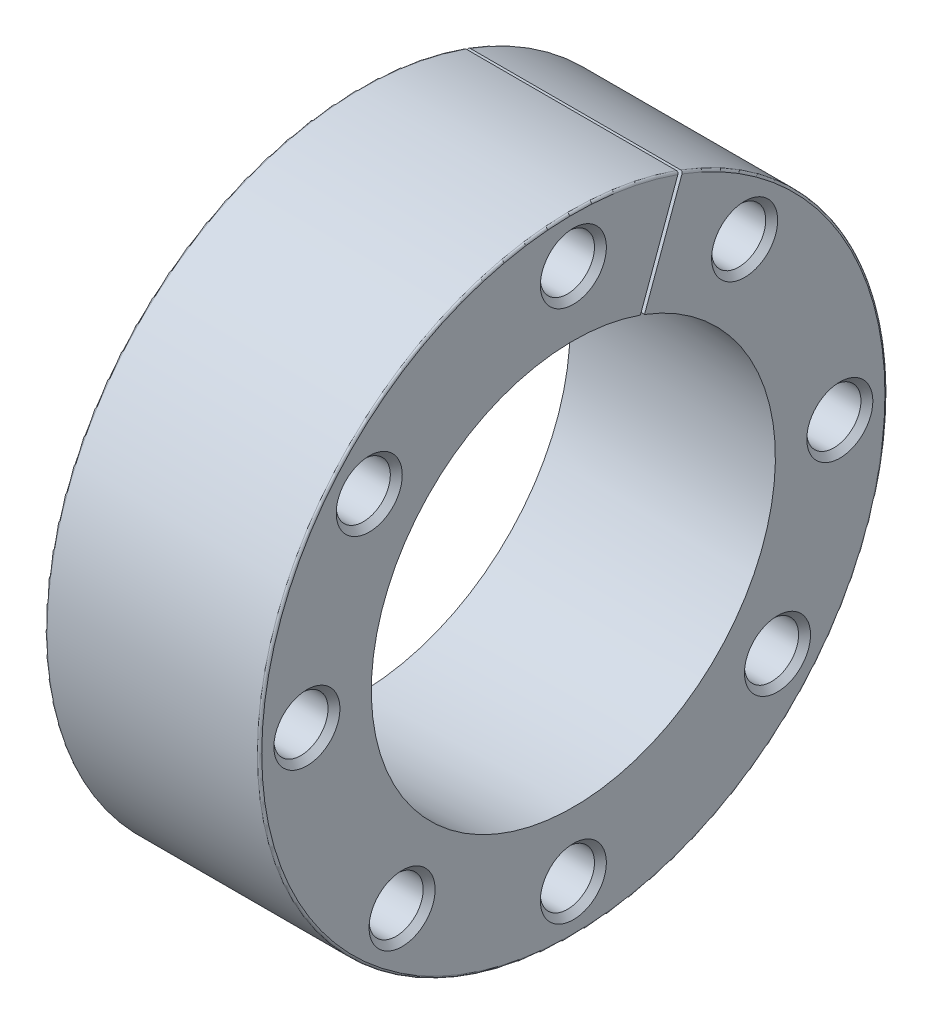
ISO-10303-21;
HEADER;
FILE_DESCRIPTION(('STEP AP214'),'2;1');
FILE_NAME('part.step','',(''),(''),'','','');
FILE_SCHEMA(('AUTOMOTIVE_DESIGN { 1 0 10303 214 1 1 1 1 }'));
ENDSEC;
DATA;
#1=APPLICATION_CONTEXT('core data for automotive mechanical design processes');
#2=APPLICATION_PROTOCOL_DEFINITION('international standard','automotive_design',2000,#1);
#3=PRODUCT_CONTEXT('',#1,'mechanical');
#4=PRODUCT('Part','Part','',(#3));
#5=PRODUCT_RELATED_PRODUCT_CATEGORY('part','',(#4));
#6=PRODUCT_DEFINITION_FORMATION('','',#4);
#7=PRODUCT_DEFINITION_CONTEXT('part definition',#1,'design');
#8=PRODUCT_DEFINITION('design','',#6,#7);
#9=PRODUCT_DEFINITION_SHAPE('','',#8);
#10=(LENGTH_UNIT() NAMED_UNIT(*) SI_UNIT(.MILLI.,.METRE.));
#11=(NAMED_UNIT(*) PLANE_ANGLE_UNIT() SI_UNIT($,.RADIAN.));
#12=(NAMED_UNIT(*) SI_UNIT($,.STERADIAN.) SOLID_ANGLE_UNIT());
#13=UNCERTAINTY_MEASURE_WITH_UNIT(LENGTH_MEASURE(1.E-05),#10,'distance_accuracy_value','');
#14=(GEOMETRIC_REPRESENTATION_CONTEXT(3) GLOBAL_UNCERTAINTY_ASSIGNED_CONTEXT((#13)) GLOBAL_UNIT_ASSIGNED_CONTEXT((#10,
#11,#12)) REPRESENTATION_CONTEXT('',''));
#15=CARTESIAN_POINT('',(0.,0.,0.));
#16=DIRECTION('',(0.,0.,1.));
#17=DIRECTION('',(1.,0.,0.));
#18=AXIS2_PLACEMENT_3D('',#15,#16,#17);
#19=CARTESIAN_POINT('',(20.25,24.2,0.));
#20=DIRECTION('',(1.,0.,0.));
#21=DIRECTION('',(0.,0.,-1.));
#22=AXIS2_PLACEMENT_3D('',#19,#20,#21);
#23=CYLINDRICAL_SURFACE('',#22,2.4585);
#24=CARTESIAN_POINT('',(29.4585000000325,24.2,0.));
#25=DIRECTION('',(1.,0.,0.));
#26=DIRECTION('',(0.,1.,0.));
#27=AXIS2_PLACEMENT_3D('',#24,#25,#26);
#28=CIRCLE('',#27,2.45850000005321);
#29=CARTESIAN_POINT('',(29.4585000000325,26.6585000000532,0.));
#30=VERTEX_POINT('',#29);
#31=EDGE_CURVE('E303',#30,#30,#28,.T.);
#32=ORIENTED_EDGE('',*,*,#31,.T.);
#33=EDGE_LOOP('',(#32));
#34=FACE_BOUND('',#33,.T.);
#35=CARTESIAN_POINT('',(11.0414999999762,24.2,0.));
#36=DIRECTION('',(-1.,0.,0.));
#37=DIRECTION('',(0.,1.,0.));
#38=AXIS2_PLACEMENT_3D('',#35,#36,#37);
#39=CIRCLE('',#38,2.45850000005321);
#40=CARTESIAN_POINT('',(11.0414999999762,26.6585000000532,0.));
#41=VERTEX_POINT('',#40);
#42=EDGE_CURVE('E306',#41,#41,#39,.T.);
#43=ORIENTED_EDGE('',*,*,#42,.T.);
#44=EDGE_LOOP('',(#43));
#45=FACE_BOUND('',#44,.T.);
#46=ADVANCED_FACE('F17',(#34,#45),#23,.F.);
#47=CARTESIAN_POINT('',(20.25,18.5382755234793,-15.5554601544143));
#48=DIRECTION('',(1.,0.,0.));
#49=DIRECTION('',(0.,0.,-1.));
#50=AXIS2_PLACEMENT_3D('',#47,#48,#49);
#51=CYLINDRICAL_SURFACE('',#50,2.4585);
#52=CARTESIAN_POINT('',(29.4585000000325,18.5382755234793,-15.5554601544143));
#53=DIRECTION('',(1.,0.,0.));
#54=DIRECTION('',(0.,1.,0.));
#55=AXIS2_PLACEMENT_3D('',#52,#53,#54);
#56=CIRCLE('',#55,2.45850000000637);
#57=CARTESIAN_POINT('',(29.4585000000325,20.9967755234857,-15.5554601544143));
#58=VERTEX_POINT('',#57);
#59=EDGE_CURVE('E300',#58,#58,#56,.T.);
#60=ORIENTED_EDGE('',*,*,#59,.T.);
#61=EDGE_LOOP('',(#60));
#62=FACE_BOUND('',#61,.T.);
#63=CARTESIAN_POINT('',(11.041500000033,18.5382755234793,-15.5554601544143));
#64=DIRECTION('',(-1.,0.,0.));
#65=DIRECTION('',(0.,1.,0.));
#66=AXIS2_PLACEMENT_3D('',#63,#64,#65);
#67=CIRCLE('',#66,2.45849999994952);
#68=CARTESIAN_POINT('',(11.041500000033,20.9967755234288,-15.5554601544143));
#69=VERTEX_POINT('',#68);
#70=EDGE_CURVE('E309',#69,#69,#67,.T.);
#71=ORIENTED_EDGE('',*,*,#70,.T.);
#72=EDGE_LOOP('',(#71));
#73=FACE_BOUND('',#72,.T.);
#74=ADVANCED_FACE('F618',(#62,#73),#51,.F.);
#75=CARTESIAN_POINT('',(20.25,0.,-24.2));
#76=DIRECTION('',(1.,0.,0.));
#77=DIRECTION('',(0.,0.,-1.));
#78=AXIS2_PLACEMENT_3D('',#75,#76,#77);
#79=CYLINDRICAL_SURFACE('',#78,2.4585);
#80=CARTESIAN_POINT('',(29.4585000000325,0.,-24.2));
#81=DIRECTION('',(1.,0.,0.));
#82=DIRECTION('',(0.,1.,0.));
#83=AXIS2_PLACEMENT_3D('',#80,#81,#82);
#84=CIRCLE('',#83,2.45850000004566);
#85=CARTESIAN_POINT('',(29.4585000000325,2.45850000004566,-24.2));
#86=VERTEX_POINT('',#85);
#87=EDGE_CURVE('E297',#86,#86,#84,.T.);
#88=ORIENTED_EDGE('',*,*,#87,.T.);
#89=EDGE_LOOP('',(#88));
#90=FACE_BOUND('',#89,.T.);
#91=CARTESIAN_POINT('',(11.0415000000899,0.,-24.2));
#92=DIRECTION('',(-1.,0.,0.));
#93=DIRECTION('',(0.,1.,0.));
#94=AXIS2_PLACEMENT_3D('',#91,#92,#93);
#95=CIRCLE('',#94,2.45850000004566);
#96=CARTESIAN_POINT('',(11.0415000000899,2.45850000004566,-24.2));
#97=VERTEX_POINT('',#96);
#98=EDGE_CURVE('E312',#97,#97,#95,.T.);
#99=ORIENTED_EDGE('',*,*,#98,.T.);
#100=EDGE_LOOP('',(#99));
#101=FACE_BOUND('',#100,.T.);
#102=ADVANCED_FACE('F608',(#90,#101),#79,.F.);
#103=CARTESIAN_POINT('',(20.25,-15.5554601544143,-18.5382755234793));
#104=DIRECTION('',(1.,0.,0.));
#105=DIRECTION('',(0.,0.,-1.));
#106=AXIS2_PLACEMENT_3D('',#103,#104,#105);
#107=CYLINDRICAL_SURFACE('',#106,2.4585);
#108=CARTESIAN_POINT('',(29.4585000000325,-15.5554601544143,-18.5382755234793));
#109=DIRECTION('',(1.,0.,0.));
#110=DIRECTION('',(0.,1.,0.));
#111=AXIS2_PLACEMENT_3D('',#108,#109,#110);
#112=CIRCLE('',#111,2.45850000004318);
#113=CARTESIAN_POINT('',(29.4585000000325,-13.0969601543711,-18.5382755234793));
#114=VERTEX_POINT('',#113);
#115=EDGE_CURVE('E294',#114,#114,#112,.T.);
#116=ORIENTED_EDGE('',*,*,#115,.T.);
#117=EDGE_LOOP('',(#116));
#118=FACE_BOUND('',#117,.T.);
#119=CARTESIAN_POINT('',(11.0414999999762,-15.5554601544143,-18.5382755234793));
#120=DIRECTION('',(-1.,0.,0.));
#121=DIRECTION('',(0.,1.,0.));
#122=AXIS2_PLACEMENT_3D('',#119,#120,#121);
#123=CIRCLE('',#122,2.45850000004318);
#124=CARTESIAN_POINT('',(11.0414999999762,-13.0969601543711,-18.5382755234793));
#125=VERTEX_POINT('',#124);
#126=EDGE_CURVE('E315',#125,#125,#123,.T.);
#127=ORIENTED_EDGE('',*,*,#126,.T.);
#128=EDGE_LOOP('',(#127));
#129=FACE_BOUND('',#128,.T.);
#130=ADVANCED_FACE('F598',(#118,#129),#107,.F.);
#131=CARTESIAN_POINT('',(20.25,-24.2,0.));
#132=DIRECTION('',(1.,0.,0.));
#133=DIRECTION('',(0.,0.,-1.));
#134=AXIS2_PLACEMENT_3D('',#131,#132,#133);
#135=CYLINDRICAL_SURFACE('',#134,2.4585);
#136=CARTESIAN_POINT('',(29.4585000000325,-24.2,0.));
#137=DIRECTION('',(1.,0.,0.));
#138=DIRECTION('',(0.,1.,0.));
#139=AXIS2_PLACEMENT_3D('',#136,#137,#138);
#140=CIRCLE('',#139,2.45850000003811);
#141=CARTESIAN_POINT('',(29.4585000000325,-21.7414999999619,0.));
#142=VERTEX_POINT('',#141);
#143=EDGE_CURVE('E291',#142,#142,#140,.T.);
#144=ORIENTED_EDGE('',*,*,#143,.T.);
#145=EDGE_LOOP('',(#144));
#146=FACE_BOUND('',#145,.T.);
#147=CARTESIAN_POINT('',(11.0414999999762,-24.2,0.));
#148=DIRECTION('',(-1.,0.,0.));
#149=DIRECTION('',(0.,1.,0.));
#150=AXIS2_PLACEMENT_3D('',#147,#148,#149);
#151=CIRCLE('',#150,2.45850000003811);
#152=CARTESIAN_POINT('',(11.0414999999762,-21.7414999999619,0.));
#153=VERTEX_POINT('',#152);
#154=EDGE_CURVE('E318',#153,#153,#151,.T.);
#155=ORIENTED_EDGE('',*,*,#154,.T.);
#156=EDGE_LOOP('',(#155));
#157=FACE_BOUND('',#156,.T.);
#158=ADVANCED_FACE('F588',(#146,#157),#135,.F.);
#159=CARTESIAN_POINT('',(20.25,-18.5382755234793,15.5554601544143));
#160=DIRECTION('',(1.,0.,0.));
#161=DIRECTION('',(0.,0.,-1.));
#162=AXIS2_PLACEMENT_3D('',#159,#160,#161);
#163=CYLINDRICAL_SURFACE('',#162,2.4585);
#164=CARTESIAN_POINT('',(29.4585000000325,-18.5382755234793,15.5554601544143));
#165=DIRECTION('',(1.,0.,0.));
#166=DIRECTION('',(0.,1.,0.));
#167=AXIS2_PLACEMENT_3D('',#164,#165,#166);
#168=CIRCLE('',#167,2.45850000002811);
#169=CARTESIAN_POINT('',(29.4585000000325,-16.0797755234512,15.5554601544143));
#170=VERTEX_POINT('',#169);
#171=EDGE_CURVE('E288',#170,#170,#168,.T.);
#172=ORIENTED_EDGE('',*,*,#171,.T.);
#173=EDGE_LOOP('',(#172));
#174=FACE_BOUND('',#173,.T.);
#175=CARTESIAN_POINT('',(11.0414999999762,-18.5382755234793,15.5554601544143));
#176=DIRECTION('',(-1.,0.,0.));
#177=DIRECTION('',(0.,1.,0.));
#178=AXIS2_PLACEMENT_3D('',#175,#176,#177);
#179=CIRCLE('',#178,2.45850000002811);
#180=CARTESIAN_POINT('',(11.0414999999762,-16.0797755234512,15.5554601544143));
#181=VERTEX_POINT('',#180);
#182=EDGE_CURVE('E321',#181,#181,#179,.T.);
#183=ORIENTED_EDGE('',*,*,#182,.T.);
#184=EDGE_LOOP('',(#183));
#185=FACE_BOUND('',#184,.T.);
#186=ADVANCED_FACE('F578',(#174,#185),#163,.F.);
#187=CARTESIAN_POINT('',(20.25,0.,24.2));
#188=DIRECTION('',(1.,0.,0.));
#189=DIRECTION('',(0.,0.,-1.));
#190=AXIS2_PLACEMENT_3D('',#187,#188,#189);
#191=CYLINDRICAL_SURFACE('',#190,2.4585);
#192=CARTESIAN_POINT('',(29.4585000000325,0.,24.2));
#193=DIRECTION('',(1.,0.,0.));
#194=DIRECTION('',(0.,1.,0.));
#195=AXIS2_PLACEMENT_3D('',#192,#193,#194);
#196=CIRCLE('',#195,2.45850000004566);
#197=CARTESIAN_POINT('',(29.4585000000325,2.45850000004566,24.2));
#198=VERTEX_POINT('',#197);
#199=EDGE_CURVE('E285',#198,#198,#196,.T.);
#200=ORIENTED_EDGE('',*,*,#199,.T.);
#201=EDGE_LOOP('',(#200));
#202=FACE_BOUND('',#201,.T.);
#203=CARTESIAN_POINT('',(11.0415000000899,0.,24.2));
#204=DIRECTION('',(-1.,0.,0.));
#205=DIRECTION('',(0.,1.,0.));
#206=AXIS2_PLACEMENT_3D('',#203,#204,#205);
#207=CIRCLE('',#206,2.45850000004566);
#208=CARTESIAN_POINT('',(11.0415000000899,2.45850000004566,24.2));
#209=VERTEX_POINT('',#208);
#210=EDGE_CURVE('E324',#209,#209,#207,.T.);
#211=ORIENTED_EDGE('',*,*,#210,.T.);
#212=EDGE_LOOP('',(#211));
#213=FACE_BOUND('',#212,.T.);
#214=ADVANCED_FACE('F568',(#202,#213),#191,.F.);
#215=CARTESIAN_POINT('',(20.25,15.5554601544143,18.5382755234793));
#216=DIRECTION('',(1.,0.,0.));
#217=DIRECTION('',(0.,0.,-1.));
#218=AXIS2_PLACEMENT_3D('',#215,#216,#217);
#219=CYLINDRICAL_SURFACE('',#218,2.4585);
#220=CARTESIAN_POINT('',(29.4585000000325,15.5554601544143,18.5382755234793));
#221=DIRECTION('',(1.,0.,0.));
#222=DIRECTION('',(0.,1.,0.));
#223=AXIS2_PLACEMENT_3D('',#220,#221,#222);
#224=CIRCLE('',#223,2.45850000004814);
#225=CARTESIAN_POINT('',(29.4585000000325,18.0139601544624,18.5382755234793));
#226=VERTEX_POINT('',#225);
#227=EDGE_CURVE('E282',#226,#226,#224,.T.);
#228=ORIENTED_EDGE('',*,*,#227,.T.);
#229=EDGE_LOOP('',(#228));
#230=FACE_BOUND('',#229,.T.);
#231=CARTESIAN_POINT('',(11.0414999999762,15.5554601544143,18.5382755234793));
#232=DIRECTION('',(-1.,0.,0.));
#233=DIRECTION('',(0.,1.,0.));
#234=AXIS2_PLACEMENT_3D('',#231,#232,#233);
#235=CIRCLE('',#234,2.45849999999129);
#236=CARTESIAN_POINT('',(11.0414999999762,18.0139601544056,18.5382755234793));
#237=VERTEX_POINT('',#236);
#238=EDGE_CURVE('E327',#237,#237,#235,.T.);
#239=ORIENTED_EDGE('',*,*,#238,.T.);
#240=EDGE_LOOP('',(#239));
#241=FACE_BOUND('',#240,.T.);
#242=ADVANCED_FACE('F558',(#230,#241),#219,.F.);
#243=CARTESIAN_POINT('',(10.5000000000928,15.5554601544143,18.5382755234793));
#244=DIRECTION('',(-1.,0.,0.));
#245=DIRECTION('',(0.,0.,1.));
#246=AXIS2_PLACEMENT_3D('',#243,#244,#245);
#247=CONICAL_SURFACE('',#246,2.99999999987469,0.785398163397448);
#248=CARTESIAN_POINT('',(10.5000000000359,15.5554601544143,18.5382755234793));
#249=DIRECTION('',(-1.,0.,0.));
#250=DIRECTION('',(0.,0.,1.));
#251=AXIS2_PLACEMENT_3D('',#248,#249,#250);
#252=CIRCLE('',#251,2.99999999993154);
#253=CARTESIAN_POINT('',(10.5000000000359,15.5554601544143,21.5382755234108));
#254=VERTEX_POINT('',#253);
#255=EDGE_CURVE('E683',#254,#254,#252,.F.);
#256=ORIENTED_EDGE('',*,*,#255,.F.);
#257=EDGE_LOOP('',(#256));
#258=FACE_BOUND('',#257,.T.);
#259=ORIENTED_EDGE('',*,*,#238,.F.);
#260=EDGE_LOOP('',(#259));
#261=FACE_BOUND('',#260,.T.);
#262=ADVANCED_FACE('F548',(#258,#261),#247,.F.);
#263=CARTESIAN_POINT('',(10.4999999999791,0.,24.2));
#264=DIRECTION('',(-1.,0.,0.));
#265=DIRECTION('',(0.,0.,1.));
#266=AXIS2_PLACEMENT_3D('',#263,#264,#265);
#267=CONICAL_SURFACE('',#266,3.00000000015643,0.785398163397448);
#268=CARTESIAN_POINT('',(10.5000000000359,0.,24.2));
#269=DIRECTION('',(-1.,0.,0.));
#270=DIRECTION('',(0.,0.,1.));
#271=AXIS2_PLACEMENT_3D('',#268,#269,#270);
#272=CIRCLE('',#271,3.00000000009959);
#273=CARTESIAN_POINT('',(10.5000000000359,0.,27.2000000000996));
#274=VERTEX_POINT('',#273);
#275=EDGE_CURVE('E685',#274,#274,#272,.F.);
#276=ORIENTED_EDGE('',*,*,#275,.F.);
#277=EDGE_LOOP('',(#276));
#278=FACE_BOUND('',#277,.T.);
#279=ORIENTED_EDGE('',*,*,#210,.F.);
#280=EDGE_LOOP('',(#279));
#281=FACE_BOUND('',#280,.T.);
#282=ADVANCED_FACE('F538',(#278,#281),#267,.F.);
#283=CARTESIAN_POINT('',(10.5000000000928,-18.5382755234793,15.5554601544143));
#284=DIRECTION('',(-1.,0.,0.));
#285=DIRECTION('',(0.,0.,1.));
#286=AXIS2_PLACEMENT_3D('',#283,#284,#285);
#287=CONICAL_SURFACE('',#286,2.99999999991151,0.785398163397448);
#288=CARTESIAN_POINT('',(10.5000000000359,-18.5382755234793,15.5554601544143));
#289=DIRECTION('',(-1.,0.,0.));
#290=DIRECTION('',(0.,0.,1.));
#291=AXIS2_PLACEMENT_3D('',#288,#289,#290);
#292=CIRCLE('',#291,2.99999999996835);
#293=CARTESIAN_POINT('',(10.5000000000359,-18.5382755234793,18.5554601543827));
#294=VERTEX_POINT('',#293);
#295=EDGE_CURVE('E688',#294,#294,#292,.F.);
#296=ORIENTED_EDGE('',*,*,#295,.F.);
#297=EDGE_LOOP('',(#296));
#298=FACE_BOUND('',#297,.T.);
#299=ORIENTED_EDGE('',*,*,#182,.F.);
#300=EDGE_LOOP('',(#299));
#301=FACE_BOUND('',#300,.T.);
#302=ADVANCED_FACE('F528',(#298,#301),#287,.F.);
#303=CARTESIAN_POINT('',(10.5000000000928,-24.2,0.));
#304=DIRECTION('',(-1.,0.,0.));
#305=DIRECTION('',(0.,0.,1.));
#306=AXIS2_PLACEMENT_3D('',#303,#304,#305);
#307=CONICAL_SURFACE('',#306,2.99999999992151,0.785398163397448);
#308=CARTESIAN_POINT('',(10.5000000000359,-24.2,0.));
#309=DIRECTION('',(-1.,0.,0.));
#310=DIRECTION('',(0.,0.,1.));
#311=AXIS2_PLACEMENT_3D('',#308,#309,#310);
#312=CIRCLE('',#311,2.99999999997835);
#313=CARTESIAN_POINT('',(10.5000000000359,-24.2,2.99999999997835));
#314=VERTEX_POINT('',#313);
#315=EDGE_CURVE('E713',#314,#314,#312,.F.);
#316=ORIENTED_EDGE('',*,*,#315,.F.);
#317=EDGE_LOOP('',(#316));
#318=FACE_BOUND('',#317,.T.);
#319=ORIENTED_EDGE('',*,*,#154,.F.);
#320=EDGE_LOOP('',(#319));
#321=FACE_BOUND('',#320,.T.);
#322=ADVANCED_FACE('F518',(#318,#321),#307,.F.);
#323=CARTESIAN_POINT('',(10.5000000000928,-15.5554601544143,-18.5382755234793));
#324=DIRECTION('',(-1.,0.,0.));
#325=DIRECTION('',(0.,0.,1.));
#326=AXIS2_PLACEMENT_3D('',#323,#324,#325);
#327=CONICAL_SURFACE('',#326,2.99999999992658,0.785398163397448);
#328=CARTESIAN_POINT('',(10.5000000000359,-15.5554601544143,-18.5382755234793));
#329=DIRECTION('',(-1.,0.,0.));
#330=DIRECTION('',(0.,0.,1.));
#331=AXIS2_PLACEMENT_3D('',#328,#329,#330);
#332=CIRCLE('',#331,2.99999999998343);
#333=CARTESIAN_POINT('',(10.5000000000359,-15.5554601544143,-15.5382755234959));
#334=VERTEX_POINT('',#333);
#335=EDGE_CURVE('E716',#334,#334,#332,.F.);
#336=ORIENTED_EDGE('',*,*,#335,.F.);
#337=EDGE_LOOP('',(#336));
#338=FACE_BOUND('',#337,.T.);
#339=ORIENTED_EDGE('',*,*,#126,.F.);
#340=EDGE_LOOP('',(#339));
#341=FACE_BOUND('',#340,.T.);
#342=ADVANCED_FACE('F508',(#338,#341),#327,.F.);
#343=CARTESIAN_POINT('',(10.4999999999791,0.,-24.2));
#344=DIRECTION('',(-1.,0.,0.));
#345=DIRECTION('',(0.,0.,1.));
#346=AXIS2_PLACEMENT_3D('',#343,#344,#345);
#347=CONICAL_SURFACE('',#346,3.00000000015643,0.785398163397448);
#348=CARTESIAN_POINT('',(10.5000000000359,0.,-24.2));
#349=DIRECTION('',(-1.,0.,0.));
#350=DIRECTION('',(0.,0.,1.));
#351=AXIS2_PLACEMENT_3D('',#348,#349,#350);
#352=CIRCLE('',#351,3.00000000009959);
#353=CARTESIAN_POINT('',(10.5000000000359,0.,-21.1999999999004));
#354=VERTEX_POINT('',#353);
#355=EDGE_CURVE('E719',#354,#354,#352,.F.);
#356=ORIENTED_EDGE('',*,*,#355,.F.);
#357=EDGE_LOOP('',(#356));
#358=FACE_BOUND('',#357,.T.);
#359=ORIENTED_EDGE('',*,*,#98,.F.);
#360=EDGE_LOOP('',(#359));
#361=FACE_BOUND('',#360,.T.);
#362=ADVANCED_FACE('F498',(#358,#361),#347,.F.);
#363=CARTESIAN_POINT('',(10.5000000000928,18.5382755234793,-15.5554601544143));
#364=DIRECTION('',(-1.,0.,0.));
#365=DIRECTION('',(0.,0.,1.));
#366=AXIS2_PLACEMENT_3D('',#363,#364,#365);
#367=CONICAL_SURFACE('',#366,2.99999999988976,0.785398163397448);
#368=CARTESIAN_POINT('',(10.5000000000359,18.5382755234793,-15.5554601544143));
#369=DIRECTION('',(-1.,0.,0.));
#370=DIRECTION('',(0.,0.,1.));
#371=AXIS2_PLACEMENT_3D('',#368,#369,#370);
#372=CIRCLE('',#371,2.99999999994661);
#373=CARTESIAN_POINT('',(10.5000000000359,18.5382755234793,-12.5554601544677));
#374=VERTEX_POINT('',#373);
#375=EDGE_CURVE('E722',#374,#374,#372,.F.);
#376=ORIENTED_EDGE('',*,*,#375,.F.);
#377=EDGE_LOOP('',(#376));
#378=FACE_BOUND('',#377,.T.);
#379=ORIENTED_EDGE('',*,*,#70,.F.);
#380=EDGE_LOOP('',(#379));
#381=FACE_BOUND('',#380,.T.);
#382=ADVANCED_FACE('F488',(#378,#381),#367,.F.);
#383=CARTESIAN_POINT('',(10.4999999999791,24.2,0.));
#384=DIRECTION('',(-1.,0.,0.));
#385=DIRECTION('',(0.,0.,1.));
#386=AXIS2_PLACEMENT_3D('',#383,#384,#385);
#387=CONICAL_SURFACE('',#386,3.0000000000503,0.785398163397448);
#388=CARTESIAN_POINT('',(10.4999999999791,24.2,0.));
#389=DIRECTION('',(-1.,0.,0.));
#390=DIRECTION('',(0.,0.,1.));
#391=AXIS2_PLACEMENT_3D('',#388,#389,#390);
#392=CIRCLE('',#391,3.0000000000503);
#393=CARTESIAN_POINT('',(10.4999999999791,24.2,3.0000000000503));
#394=VERTEX_POINT('',#393);
#395=EDGE_CURVE('E104',#394,#394,#392,.F.);
#396=ORIENTED_EDGE('',*,*,#395,.F.);
#397=EDGE_LOOP('',(#396));
#398=FACE_BOUND('',#397,.T.);
#399=ORIENTED_EDGE('',*,*,#42,.F.);
#400=EDGE_LOOP('',(#399));
#401=FACE_BOUND('',#400,.T.);
#402=ADVANCED_FACE('F479',(#398,#401),#387,.F.);
#403=CARTESIAN_POINT('',(10.5,0.,0.));
#404=DIRECTION('',(-1.,0.,0.));
#405=DIRECTION('',(0.,0.,1.));
#406=AXIS2_PLACEMENT_3D('',#403,#404,#405);
#407=CONICAL_SURFACE('',#406,19.2,0.0435621672281694);
#408=CARTESIAN_POINT('',(10.5,0.,0.));
#409=DIRECTION('',(-1.,0.,0.));
#410=DIRECTION('',(0.,0.,1.));
#411=AXIS2_PLACEMENT_3D('',#408,#409,#410);
#412=CIRCLE('',#411,19.2);
#413=CARTESIAN_POINT('',(10.5,18.1095234747202,-6.37849194704804));
#414=VERTEX_POINT('',#413);
#415=CARTESIAN_POINT('',(10.5,17.97271541739,-6.75436899536241));
#416=VERTEX_POINT('',#415);
#417=EDGE_CURVE('E112',#414,#416,#412,.F.);
#418=ORIENTED_EDGE('',*,*,#417,.F.);
#419=DIRECTION('',(-0.999051211264734,0.0409244203007099,-0.0148952708440579));
#420=VECTOR('',#419,1.);
#421=CARTESIAN_POINT('',(30.,17.3107394015258,-6.08775832079935));
#422=LINE('',#421,#420);
#423=CARTESIAN_POINT('',(30.,17.3107394015258,-6.08775832079935));
#424=VERTEX_POINT('',#423);
#425=EDGE_CURVE('E175',#414,#424,#422,.F.);
#426=ORIENTED_EDGE('',*,*,#425,.T.);
#427=CARTESIAN_POINT('',(30.,0.,0.));
#428=DIRECTION('',(-1.,0.,0.));
#429=DIRECTION('',(0.,0.,1.));
#430=AXIS2_PLACEMENT_3D('',#427,#428,#429);
#431=CIRCLE('',#430,18.35);
#432=CARTESIAN_POINT('',(30.,17.1739313441955,-6.46363536911372));
#433=VERTEX_POINT('',#432);
#434=EDGE_CURVE('E253',#433,#424,#431,.T.);
#435=ORIENTED_EDGE('',*,*,#434,.F.);
#436=DIRECTION('',(0.999051211264734,-0.0409244203007143,0.0148952708440595));
#437=VECTOR('',#436,1.);
#438=CARTESIAN_POINT('',(10.5,17.97271541739,-6.75436899536241));
#439=LINE('',#438,#437);
#440=EDGE_CURVE('E103',#416,#433,#439,.T.);
#441=ORIENTED_EDGE('',*,*,#440,.F.);
#442=EDGE_LOOP('',(#418,#426,#435,#441));
#443=FACE_BOUND('',#442,.T.);
#444=ADVANCED_FACE('F346',(#443),#407,.F.);
#445=CARTESIAN_POINT('',(29.9999999999159,24.2,0.));
#446=DIRECTION('',(1.,0.,0.));
#447=DIRECTION('',(0.,0.,-1.));
#448=AXIS2_PLACEMENT_3D('',#445,#446,#447);
#449=CONICAL_SURFACE('',#448,2.99999999993661,0.785398163397448);
#450=CARTESIAN_POINT('',(30.0000000000296,24.2,0.));
#451=DIRECTION('',(1.,0.,0.));
#452=DIRECTION('',(0.,0.,-1.));
#453=AXIS2_PLACEMENT_3D('',#450,#451,#452);
#454=CIRCLE('',#453,3.0000000000503);
#455=CARTESIAN_POINT('',(30.0000000000296,24.2,-3.0000000000503));
#456=VERTEX_POINT('',#455);
#457=EDGE_CURVE('E248',#456,#456,#454,.F.);
#458=ORIENTED_EDGE('',*,*,#457,.F.);
#459=EDGE_LOOP('',(#458));
#460=FACE_BOUND('',#459,.T.);
#461=ORIENTED_EDGE('',*,*,#31,.F.);
#462=EDGE_LOOP('',(#461));
#463=FACE_BOUND('',#462,.T.);
#464=ADVANCED_FACE('F460',(#460,#463),#449,.F.);
#465=CARTESIAN_POINT('',(30.0000000000296,18.5382755234793,-15.5554601544143));
#466=DIRECTION('',(1.,0.,0.));
#467=DIRECTION('',(0.,0.,-1.));
#468=AXIS2_PLACEMENT_3D('',#465,#466,#467);
#469=CONICAL_SURFACE('',#468,3.00000000000345,0.785398163397448);
#470=CARTESIAN_POINT('',(30.0000000000296,18.5382755234793,-15.5554601544143));
#471=DIRECTION('',(1.,0.,0.));
#472=DIRECTION('',(0.,0.,-1.));
#473=AXIS2_PLACEMENT_3D('',#470,#471,#472);
#474=CIRCLE('',#473,3.00000000000345);
#475=CARTESIAN_POINT('',(30.0000000000296,18.5382755234793,-18.5554601544178));
#476=VERTEX_POINT('',#475);
#477=EDGE_CURVE('E251',#476,#476,#474,.F.);
#478=ORIENTED_EDGE('',*,*,#477,.F.);
#479=EDGE_LOOP('',(#478));
#480=FACE_BOUND('',#479,.T.);
#481=ORIENTED_EDGE('',*,*,#59,.F.);
#482=EDGE_LOOP('',(#481));
#483=FACE_BOUND('',#482,.T.);
#484=ADVANCED_FACE('F450',(#480,#483),#469,.F.);
#485=CARTESIAN_POINT('',(30.0000000000296,0.,-24.2));
#486=DIRECTION('',(1.,0.,0.));
#487=DIRECTION('',(0.,0.,-1.));
#488=AXIS2_PLACEMENT_3D('',#485,#486,#487);
#489=CONICAL_SURFACE('',#488,3.00000000004275,0.785398163344961);
#490=CARTESIAN_POINT('',(30.0000000000296,0.,-24.2));
#491=DIRECTION('',(1.,0.,0.));
#492=DIRECTION('',(0.,0.,-1.));
#493=AXIS2_PLACEMENT_3D('',#490,#491,#492);
#494=CIRCLE('',#493,3.00000000004275);
#495=CARTESIAN_POINT('',(30.0000000000296,0.,-27.2000000000427));
#496=VERTEX_POINT('',#495);
#497=EDGE_CURVE('E341',#496,#496,#494,.F.);
#498=ORIENTED_EDGE('',*,*,#497,.F.);
#499=EDGE_LOOP('',(#498));
#500=FACE_BOUND('',#499,.T.);
#501=ORIENTED_EDGE('',*,*,#87,.F.);
#502=EDGE_LOOP('',(#501));
#503=FACE_BOUND('',#502,.T.);
#504=ADVANCED_FACE('F440',(#500,#503),#489,.F.);
#505=CARTESIAN_POINT('',(29.9999999999159,-15.5554601544143,-18.5382755234793));
#506=DIRECTION('',(1.,0.,0.));
#507=DIRECTION('',(0.,0.,-1.));
#508=AXIS2_PLACEMENT_3D('',#505,#506,#507);
#509=CONICAL_SURFACE('',#508,2.99999999992658,0.785398163397448);
#510=CARTESIAN_POINT('',(30.0000000000296,-15.5554601544143,-18.5382755234793));
#511=DIRECTION('',(1.,0.,0.));
#512=DIRECTION('',(0.,0.,-1.));
#513=AXIS2_PLACEMENT_3D('',#510,#511,#512);
#514=CIRCLE('',#513,3.00000000004027);
#515=CARTESIAN_POINT('',(30.0000000000296,-15.5554601544143,-21.5382755235196));
#516=VERTEX_POINT('',#515);
#517=EDGE_CURVE('E338',#516,#516,#514,.F.);
#518=ORIENTED_EDGE('',*,*,#517,.F.);
#519=EDGE_LOOP('',(#518));
#520=FACE_BOUND('',#519,.T.);
#521=ORIENTED_EDGE('',*,*,#115,.F.);
#522=EDGE_LOOP('',(#521));
#523=FACE_BOUND('',#522,.T.);
#524=ADVANCED_FACE('F430',(#520,#523),#509,.F.);
#525=CARTESIAN_POINT('',(29.9999999999159,-24.2,0.));
#526=DIRECTION('',(1.,0.,0.));
#527=DIRECTION('',(0.,0.,-1.));
#528=AXIS2_PLACEMENT_3D('',#525,#526,#527);
#529=CONICAL_SURFACE('',#528,2.99999999992151,0.785398163397448);
#530=CARTESIAN_POINT('',(30.0000000000296,-24.2,0.));
#531=DIRECTION('',(1.,0.,0.));
#532=DIRECTION('',(0.,0.,-1.));
#533=AXIS2_PLACEMENT_3D('',#530,#531,#532);
#534=CIRCLE('',#533,3.0000000000352);
#535=CARTESIAN_POINT('',(30.0000000000296,-24.2,-3.0000000000352));
#536=VERTEX_POINT('',#535);
#537=EDGE_CURVE('E335',#536,#536,#534,.F.);
#538=ORIENTED_EDGE('',*,*,#537,.F.);
#539=EDGE_LOOP('',(#538));
#540=FACE_BOUND('',#539,.T.);
#541=ORIENTED_EDGE('',*,*,#143,.F.);
#542=EDGE_LOOP('',(#541));
#543=FACE_BOUND('',#542,.T.);
#544=ADVANCED_FACE('F420',(#540,#543),#529,.F.);
#545=CARTESIAN_POINT('',(29.9999999999159,-18.5382755234793,15.5554601544143));
#546=DIRECTION('',(1.,0.,0.));
#547=DIRECTION('',(0.,0.,-1.));
#548=AXIS2_PLACEMENT_3D('',#545,#546,#547);
#549=CONICAL_SURFACE('',#548,2.99999999991151,0.785398163397448);
#550=CARTESIAN_POINT('',(30.0000000000296,-18.5382755234793,15.5554601544143));
#551=DIRECTION('',(1.,0.,0.));
#552=DIRECTION('',(0.,0.,-1.));
#553=AXIS2_PLACEMENT_3D('',#550,#551,#552);
#554=CIRCLE('',#553,3.0000000000252);
#555=CARTESIAN_POINT('',(30.0000000000296,-18.5382755234793,12.5554601543891));
#556=VERTEX_POINT('',#555);
#557=EDGE_CURVE('E332',#556,#556,#554,.F.);
#558=ORIENTED_EDGE('',*,*,#557,.F.);
#559=EDGE_LOOP('',(#558));
#560=FACE_BOUND('',#559,.T.);
#561=ORIENTED_EDGE('',*,*,#171,.F.);
#562=EDGE_LOOP('',(#561));
#563=FACE_BOUND('',#562,.T.);
#564=ADVANCED_FACE('F410',(#560,#563),#549,.F.);
#565=CARTESIAN_POINT('',(30.0000000000296,0.,24.2));
#566=DIRECTION('',(1.,0.,0.));
#567=DIRECTION('',(0.,0.,-1.));
#568=AXIS2_PLACEMENT_3D('',#565,#566,#567);
#569=CONICAL_SURFACE('',#568,3.00000000004275,0.785398163344961);
#570=CARTESIAN_POINT('',(30.0000000000296,0.,24.2));
#571=DIRECTION('',(1.,0.,0.));
#572=DIRECTION('',(0.,0.,-1.));
#573=AXIS2_PLACEMENT_3D('',#570,#571,#572);
#574=CIRCLE('',#573,3.00000000004275);
#575=CARTESIAN_POINT('',(30.0000000000296,0.,21.1999999999573));
#576=VERTEX_POINT('',#575);
#577=EDGE_CURVE('E278',#576,#576,#574,.F.);
#578=ORIENTED_EDGE('',*,*,#577,.F.);
#579=EDGE_LOOP('',(#578));
#580=FACE_BOUND('',#579,.T.);
#581=ORIENTED_EDGE('',*,*,#199,.F.);
#582=EDGE_LOOP('',(#581));
#583=FACE_BOUND('',#582,.T.);
#584=ADVANCED_FACE('F358',(#580,#583),#569,.F.);
#585=CARTESIAN_POINT('',(29.9999999999159,15.5554601544143,18.5382755234793));
#586=DIRECTION('',(1.,0.,0.));
#587=DIRECTION('',(0.,0.,-1.));
#588=AXIS2_PLACEMENT_3D('',#585,#586,#587);
#589=CONICAL_SURFACE('',#588,2.99999999993154,0.785398163397448);
#590=CARTESIAN_POINT('',(30.0000000000296,15.5554601544143,18.5382755234793));
#591=DIRECTION('',(1.,0.,0.));
#592=DIRECTION('',(0.,0.,-1.));
#593=AXIS2_PLACEMENT_3D('',#590,#591,#592);
#594=CIRCLE('',#593,3.00000000004522);
#595=CARTESIAN_POINT('',(30.0000000000296,15.5554601544143,15.5382755234341));
#596=VERTEX_POINT('',#595);
#597=EDGE_CURVE('E275',#596,#596,#594,.F.);
#598=ORIENTED_EDGE('',*,*,#597,.F.);
#599=EDGE_LOOP('',(#598));
#600=FACE_BOUND('',#599,.T.);
#601=ORIENTED_EDGE('',*,*,#227,.F.);
#602=EDGE_LOOP('',(#601));
#603=FACE_BOUND('',#602,.T.);
#604=ADVANCED_FACE('F351',(#600,#603),#589,.F.);
#605=CARTESIAN_POINT('',(0.,0.0684040286651337,0.187938524157182));
#606=DIRECTION('',(0.,0.342020143325669,0.939692620785908));
#607=DIRECTION('',(0.,-0.939692620785908,0.342020143325669));
#608=AXIS2_PLACEMENT_3D('',#605,#606,#607);
#609=PLANE('',#608);
#610=DIRECTION('',(0.,-0.93969262078591,0.342020143325665));
#611=VECTOR('',#610,1.);
#612=CARTESIAN_POINT('',(10.5,26.6610410948893,-9.4909898185925));
#613=LINE('',#612,#611);
#614=CARTESIAN_POINT('',(10.5,26.6610410948893,-9.4909898185925));
#615=VERTEX_POINT('',#614);
#616=EDGE_CURVE('E168',#615,#414,#613,.T.);
#617=ORIENTED_EDGE('',*,*,#616,.F.);
#618=CARTESIAN_POINT('',(10.7,26.8489842795266,-9.55939554353372));
#619=CARTESIAN_POINT('',(10.6887485407542,26.8489932604803,-9.55939881233349));
#620=CARTESIAN_POINT('',(10.6774999382844,26.8480925894767,-9.55907099489733));
#621=CARTESIAN_POINT('',(10.6553295475013,26.8445382188123,-9.55777730977398));
#622=CARTESIAN_POINT('',(10.6444075095738,26.8418858958168,-9.55681194315202));
#623=CARTESIAN_POINT('',(10.6231876091262,26.8348926268442,-9.55426660140574));
#624=CARTESIAN_POINT('',(10.6128900489118,26.8305508704474,-9.55268633131282));
#625=CARTESIAN_POINT('',(10.5932184191859,26.8203057842086,-9.54895742487441));
#626=CARTESIAN_POINT('',(10.5838441875701,26.8144027291492,-9.54680888854163));
#627=CARTESIAN_POINT('',(10.5662823867247,26.8012008665883,-9.54200380353257));
#628=CARTESIAN_POINT('',(10.5580949444646,26.7939019099384,-9.53934720057077));
#629=CARTESIAN_POINT('',(10.5431403599119,26.7781158597276,-9.5336015481774));
#630=CARTESIAN_POINT('',(10.5363731950174,26.7696287850776,-9.53051250562884));
#631=CARTESIAN_POINT('',(10.5244493048606,26.7517056042616,-9.52398900130843));
#632=CARTESIAN_POINT('',(10.5192931031873,26.7422691908598,-9.52055442771191));
#633=CARTESIAN_POINT('',(10.5107424257549,26.7227187213554,-9.51343863874639));
#634=CARTESIAN_POINT('',(10.507346918782,26.7126050658324,-9.50975756917643));
#635=CARTESIAN_POINT('',(10.5032576771116,26.6955314702487,-9.50354328859204));
#636=CARTESIAN_POINT('',(10.5020367863446,26.6886789189433,-9.50104916388807));
#637=CARTESIAN_POINT('',(10.5004080551372,26.6748989006999,-9.49603364741983));
#638=CARTESIAN_POINT('',(10.4999990620662,26.6679715540251,-9.49351229942774));
#639=CARTESIAN_POINT('',(10.5,26.6610410948893,-9.49098981859253));
#640=B_SPLINE_CURVE_WITH_KNOTS('',3,(#618,#619,#620,#621,#622,#623,#624,#625,#626,#627,#628,
#629,#630,#631,#632,#633,#634,#635,#636,#637,#638,#639),.UNSPECIFIED.,.F.,.F.,(4,2,2,2,2,2,2,2,
2,2,4),(0.,0.0337095327056397,0.0673926037565874,0.10109185250348,0.134785174251809,
0.168482098051648,0.202178485567722,0.235885813587416,0.269573377342547,0.291712771647732,
0.313820712677614),.UNSPECIFIED.);
#641=CARTESIAN_POINT('',(10.7,26.8489842795266,-9.55939554353372));
#642=VERTEX_POINT('',#641);
#643=EDGE_CURVE('E77',#642,#615,#640,.T.);
#644=ORIENTED_EDGE('',*,*,#643,.F.);
#645=DIRECTION('',(1.,0.,0.));
#646=VECTOR('',#645,1.);
#647=CARTESIAN_POINT('',(20.25,26.8489842795266,-9.55939554353372));
#648=LINE('',#647,#646);
#649=CARTESIAN_POINT('',(29.8,26.8489842795266,-9.55939554353372));
#650=VERTEX_POINT('',#649);
#651=EDGE_CURVE('E274',#650,#642,#648,.F.);
#652=ORIENTED_EDGE('',*,*,#651,.F.);
#653=CARTESIAN_POINT('',(30.,26.6610410948893,-9.49098981859253));
#654=CARTESIAN_POINT('',(30.0000095552444,26.671614650113,-9.49483827796428));
#655=CARTESIAN_POINT('',(29.9990510385408,26.6821855239458,-9.49868576138962));
#656=CARTESIAN_POINT('',(29.9952683701417,26.7030201687508,-9.50626895194021));
#657=CARTESIAN_POINT('',(29.9924456808728,26.7132841738666,-9.51000474428675));
#658=CARTESIAN_POINT('',(29.9850031851762,26.7332256232095,-9.51726283827568));
#659=CARTESIAN_POINT('',(29.9803825153785,26.7429027830559,-9.52078503641194));
#660=CARTESIAN_POINT('',(29.9694792412689,26.7613892290167,-9.52751355247904));
#661=CARTESIAN_POINT('',(29.9631969300679,26.7701986678199,-9.53071992598408));
#662=CARTESIAN_POINT('',(29.9491469772385,26.7867021386792,-9.53672669813892));
#663=CARTESIAN_POINT('',(29.9413792094057,26.7943960758644,-9.5395270622586));
#664=CARTESIAN_POINT('',(29.9245791882457,26.8084491695313,-9.54464197005271));
#665=CARTESIAN_POINT('',(29.9155469555643,26.8148083478024,-9.54695652165786));
#666=CARTESIAN_POINT('',(29.8964729171904,26.8260129325827,-9.5510346570052));
#667=CARTESIAN_POINT('',(29.8864308313789,26.830857917537,-9.55279808731396));
#668=CARTESIAN_POINT('',(29.8656255506138,26.8388923179665,-9.55572236992049));
#669=CARTESIAN_POINT('',(29.8548627824528,26.8420827036848,-9.55688357535783));
#670=CARTESIAN_POINT('',(29.8366951033709,26.8459243121328,-9.5582818064846));
#671=CARTESIAN_POINT('',(29.8294044983345,26.8470711065693,-9.55869920552428));
#672=CARTESIAN_POINT('',(29.8147436144508,26.8486009891662,-9.55925603725141));
#673=CARTESIAN_POINT('',(29.8073734635145,26.8489851600326,-9.55939586401166));
#674=CARTESIAN_POINT('',(29.8,26.8489842795266,-9.55939554353374));
#675=B_SPLINE_CURVE_WITH_KNOTS('',3,(#653,#654,#655,#656,#657,#658,#659,#660,#661,#662,#663,
#664,#665,#666,#667,#668,#669,#670,#671,#672,#673,#674),.UNSPECIFIED.,.F.,.F.,(4,2,2,2,2,2,2,2,
2,2,4),(0.,0.0337115865119881,0.0673967579504088,0.101098124628495,0.134793550399495,
0.168491840207849,0.202189579861452,0.235896692703312,0.269584017567121,0.291718079750765,
0.313820695393786),.UNSPECIFIED.);
#676=CARTESIAN_POINT('',(30.,26.6610410948893,-9.4909898185925));
#677=VERTEX_POINT('',#676);
#678=EDGE_CURVE('E41',#677,#650,#675,.T.);
#679=ORIENTED_EDGE('',*,*,#678,.F.);
#680=DIRECTION('',(0.,0.939692620785909,-0.342020143325666));
#681=VECTOR('',#680,1.);
#682=CARTESIAN_POINT('',(30.,17.3107394015258,-6.08775832079935));
#683=LINE('',#682,#681);
#684=EDGE_CURVE('E249',#424,#677,#683,.T.);
#685=ORIENTED_EDGE('',*,*,#684,.F.);
#686=ORIENTED_EDGE('',*,*,#425,.F.);
#687=EDGE_LOOP('',(#617,#644,#652,#679,#685,#686));
#688=FACE_BOUND('',#687,.T.);
#689=ADVANCED_FACE('F349',(#688),#609,.F.);
#690=CARTESIAN_POINT('',(10.5,23.75,0.));
#691=DIRECTION('',(-1.,0.,0.));
#692=DIRECTION('',(0.,0.,1.));
#693=AXIS2_PLACEMENT_3D('',#690,#691,#692);
#694=PLANE('',#693);
#695=ORIENTED_EDGE('',*,*,#395,.T.);
#696=EDGE_LOOP('',(#695));
#697=FACE_BOUND('',#696,.T.);
#698=ORIENTED_EDGE('',*,*,#375,.T.);
#699=EDGE_LOOP('',(#698));
#700=FACE_BOUND('',#699,.T.);
#701=ORIENTED_EDGE('',*,*,#355,.T.);
#702=EDGE_LOOP('',(#701));
#703=FACE_BOUND('',#702,.T.);
#704=ORIENTED_EDGE('',*,*,#335,.T.);
#705=EDGE_LOOP('',(#704));
#706=FACE_BOUND('',#705,.T.);
#707=ORIENTED_EDGE('',*,*,#315,.T.);
#708=EDGE_LOOP('',(#707));
#709=FACE_BOUND('',#708,.T.);
#710=ORIENTED_EDGE('',*,*,#295,.T.);
#711=EDGE_LOOP('',(#710));
#712=FACE_BOUND('',#711,.T.);
#713=ORIENTED_EDGE('',*,*,#275,.T.);
#714=EDGE_LOOP('',(#713));
#715=FACE_BOUND('',#714,.T.);
#716=ORIENTED_EDGE('',*,*,#255,.T.);
#717=EDGE_LOOP('',(#716));
#718=FACE_BOUND('',#717,.T.);
#719=ORIENTED_EDGE('',*,*,#616,.T.);
#720=ORIENTED_EDGE('',*,*,#417,.T.);
#721=DIRECTION('',(0.,-0.939692620785908,0.342020143325669));
#722=VECTOR('',#721,1.);
#723=CARTESIAN_POINT('',(10.5,-0.0684040286651338,-0.187938524157182));
#724=LINE('',#723,#722);
#725=CARTESIAN_POINT('',(10.5,26.524233037559,-9.86686686690688));
#726=VERTEX_POINT('',#725);
#727=EDGE_CURVE('E109',#726,#416,#724,.T.);
#728=ORIENTED_EDGE('',*,*,#727,.F.);
#729=CARTESIAN_POINT('',(10.5,0.,0.));
#730=DIRECTION('',(1.,0.,0.));
#731=DIRECTION('',(0.,0.,-1.));
#732=AXIS2_PLACEMENT_3D('',#729,#730,#731);
#733=CIRCLE('',#732,28.3);
#734=CARTESIAN_POINT('',(10.5,0.,-28.3));
#735=VERTEX_POINT('',#734);
#736=EDGE_CURVE('E92',#735,#726,#733,.T.);
#737=ORIENTED_EDGE('',*,*,#736,.F.);
#738=CARTESIAN_POINT('',(10.5,0.,0.));
#739=DIRECTION('',(1.,0.,0.));
#740=DIRECTION('',(0.,0.,1.));
#741=AXIS2_PLACEMENT_3D('',#738,#739,#740);
#742=CIRCLE('',#741,28.3);
#743=CARTESIAN_POINT('',(10.5,0.,28.3));
#744=VERTEX_POINT('',#743);
#745=EDGE_CURVE('E99',#744,#735,#742,.T.);
#746=ORIENTED_EDGE('',*,*,#745,.F.);
#747=CARTESIAN_POINT('',(10.5,0.,0.));
#748=DIRECTION('',(1.,0.,0.));
#749=DIRECTION('',(0.,0.942086257769938,-0.335370664967932));
#750=AXIS2_PLACEMENT_3D('',#747,#748,#749);
#751=CIRCLE('',#750,28.3);
#752=EDGE_CURVE('E82',#615,#744,#751,.T.);
#753=ORIENTED_EDGE('',*,*,#752,.F.);
#754=EDGE_LOOP('',(#719,#720,#728,#737,#746,#753));
#755=FACE_BOUND('',#754,.T.);
#756=ADVANCED_FACE('F111',(#697,#700,#703,#706,#709,#712,#715,#718,#755),#694,.T.);
#757=CARTESIAN_POINT('',(0.,-0.0684040286651338,-0.187938524157182));
#758=DIRECTION('',(0.,0.342020143325669,0.939692620785908));
#759=DIRECTION('',(0.,-0.939692620785908,0.342020143325669));
#760=AXIS2_PLACEMENT_3D('',#757,#758,#759);
#761=PLANE('',#760);
#762=CARTESIAN_POINT('',(10.7,26.7121762221964,-9.93527259184808));
#763=CARTESIAN_POINT('',(10.6887485407542,26.71218520315,-9.93527586064795));
#764=CARTESIAN_POINT('',(10.6774999382843,26.7112845321464,-9.93494804321175));
#765=CARTESIAN_POINT('',(10.6553295475013,26.707730161482,-9.93365435808828));
#766=CARTESIAN_POINT('',(10.6444075095738,26.7050778384866,-9.93268899146624));
#767=CARTESIAN_POINT('',(10.6231876091262,26.6980845695139,-9.93014364971999));
#768=CARTESIAN_POINT('',(10.6128900489118,26.6937428131171,-9.92856337962719));
#769=CARTESIAN_POINT('',(10.5932184191859,26.6834977268783,-9.92483447318878));
#770=CARTESIAN_POINT('',(10.5838441875701,26.677594671819,-9.92268593685588));
#771=CARTESIAN_POINT('',(10.5662823867247,26.664392809258,-9.91788085184682));
#772=CARTESIAN_POINT('',(10.5580949444646,26.6570938526082,-9.91522424888512));
#773=CARTESIAN_POINT('',(10.5431403599119,26.6413078023974,-9.90947859649177));
#774=CARTESIAN_POINT('',(10.5363731950174,26.6328207277474,-9.90638955394313));
#775=CARTESIAN_POINT('',(10.5244493048606,26.6148975469313,-9.89986604962271));
#776=CARTESIAN_POINT('',(10.5192931031873,26.6054611335295,-9.89643147602626));
#777=CARTESIAN_POINT('',(10.5107424257549,26.5859106640252,-9.88931568706077));
#778=CARTESIAN_POINT('',(10.507346918782,26.5757970085022,-9.88563461749076));
#779=CARTESIAN_POINT('',(10.5032576771116,26.5587234129184,-9.87942033690637));
#780=CARTESIAN_POINT('',(10.5020367863446,26.551870861613,-9.87692621220242));
#781=CARTESIAN_POINT('',(10.5004080551372,26.5380908433696,-9.87191069573421));
#782=CARTESIAN_POINT('',(10.4999990620662,26.5311634966948,-9.86938934774212));
#783=CARTESIAN_POINT('',(10.5,26.524233037559,-9.86686686690688));
#784=B_SPLINE_CURVE_WITH_KNOTS('',3,(#762,#763,#764,#765,#766,#767,#768,#769,#770,#771,#772,
#773,#774,#775,#776,#777,#778,#779,#780,#781,#782,#783),.UNSPECIFIED.,.F.,.F.,(4,2,2,2,2,2,2,2,
2,2,4),(0.,0.0337095327056429,0.0673926037565873,0.101091852503479,0.134785174251811,
0.168482098051647,0.202178485567724,0.235885813587423,0.269573377342547,0.291712771647743,
0.313820712677637),.UNSPECIFIED.);
#785=CARTESIAN_POINT('',(10.7,26.7121762221964,-9.93527259184807));
#786=VERTEX_POINT('',#785);
#787=EDGE_CURVE('E97',#786,#726,#784,.T.);
#788=ORIENTED_EDGE('',*,*,#787,.T.);
#789=ORIENTED_EDGE('',*,*,#727,.T.);
#790=ORIENTED_EDGE('',*,*,#440,.T.);
#791=DIRECTION('',(0.,-0.939692620785909,0.342020143325667));
#792=VECTOR('',#791,1.);
#793=CARTESIAN_POINT('',(30.,26.524233037559,-9.86686686690687));
#794=LINE('',#793,#792);
#795=CARTESIAN_POINT('',(30.,26.524233037559,-9.86686686690687));
#796=VERTEX_POINT('',#795);
#797=EDGE_CURVE('E244',#796,#433,#794,.T.);
#798=ORIENTED_EDGE('',*,*,#797,.F.);
#799=CARTESIAN_POINT('',(29.8,26.7121762221964,-9.93527259184808));
#800=CARTESIAN_POINT('',(29.8112514592458,26.71218520315,-9.93527586064792));
#801=CARTESIAN_POINT('',(29.8225000617157,26.7112845321464,-9.93494804321174));
#802=CARTESIAN_POINT('',(29.8446704524987,26.707730161482,-9.9336543580883));
#803=CARTESIAN_POINT('',(29.8555924904262,26.7050778384866,-9.93268899146628));
#804=CARTESIAN_POINT('',(29.8768123908739,26.6980845695139,-9.93014364972002));
#805=CARTESIAN_POINT('',(29.8871099510882,26.6937428131171,-9.92856337962719));
#806=CARTESIAN_POINT('',(29.9067815808141,26.6834977268783,-9.92483447318877));
#807=CARTESIAN_POINT('',(29.9161558124299,26.677594671819,-9.92268593685591));
#808=CARTESIAN_POINT('',(29.9337176132753,26.664392809258,-9.91788085184685));
#809=CARTESIAN_POINT('',(29.9419050555354,26.6570938526082,-9.91522424888513));
#810=CARTESIAN_POINT('',(29.9568596400881,26.6413078023974,-9.90947859649176));
#811=CARTESIAN_POINT('',(29.9636268049826,26.6328207277474,-9.90638955394315));
#812=CARTESIAN_POINT('',(29.9755506951394,26.6148975469313,-9.89986604962273));
#813=CARTESIAN_POINT('',(29.9807068968127,26.6054611335295,-9.89643147602626));
#814=CARTESIAN_POINT('',(29.9892575742451,26.5859106640252,-9.88931568706076));
#815=CARTESIAN_POINT('',(29.992653081218,26.5757970085022,-9.88563461749077));
#816=CARTESIAN_POINT('',(29.9967423228884,26.5587234129184,-9.87942033690638));
#817=CARTESIAN_POINT('',(29.9979632136554,26.551870861613,-9.87692621220242));
#818=CARTESIAN_POINT('',(29.9995919448628,26.5380908433696,-9.8719106957342));
#819=CARTESIAN_POINT('',(30.0000009379338,26.5311634966948,-9.86938934774211));
#820=CARTESIAN_POINT('',(30.,26.524233037559,-9.86686686690689));
#821=B_SPLINE_CURVE_WITH_KNOTS('',3,(#799,#800,#801,#802,#803,#804,#805,#806,#807,#808,#809,
#810,#811,#812,#813,#814,#815,#816,#817,#818,#819,#820),.UNSPECIFIED.,.F.,.F.,(4,2,2,2,2,2,2,2,
2,2,4),(0.,0.0337095327056449,0.0673926037565905,0.101091852503483,0.134785174251811,
0.168482098051647,0.202178485567726,0.235885813587421,0.269573377342548,0.291712771647743,
0.313820712677636),.UNSPECIFIED.);
#822=CARTESIAN_POINT('',(29.8,26.7121762221964,-9.93527259184807));
#823=VERTEX_POINT('',#822);
#824=EDGE_CURVE('E115',#823,#796,#821,.T.);
#825=ORIENTED_EDGE('',*,*,#824,.F.);
#826=DIRECTION('',(1.,0.,0.));
#827=VECTOR('',#826,1.);
#828=CARTESIAN_POINT('',(20.25,26.7121762221964,-9.93527259184805));
#829=LINE('',#828,#827);
#830=EDGE_CURVE('E119',#786,#823,#829,.T.);
#831=ORIENTED_EDGE('',*,*,#830,.F.);
#832=EDGE_LOOP('',(#788,#789,#790,#798,#825,#831));
#833=FACE_BOUND('',#832,.T.);
#834=ADVANCED_FACE('F117',(#833),#761,.T.);
#835=CARTESIAN_POINT('',(30.,23.325,0.));
#836=DIRECTION('',(1.,0.,0.));
#837=DIRECTION('',(0.,0.,-1.));
#838=AXIS2_PLACEMENT_3D('',#835,#836,#837);
#839=PLANE('',#838);
#840=ORIENTED_EDGE('',*,*,#597,.T.);
#841=EDGE_LOOP('',(#840));
#842=FACE_BOUND('',#841,.T.);
#843=ORIENTED_EDGE('',*,*,#577,.T.);
#844=EDGE_LOOP('',(#843));
#845=FACE_BOUND('',#844,.T.);
#846=ORIENTED_EDGE('',*,*,#557,.T.);
#847=EDGE_LOOP('',(#846));
#848=FACE_BOUND('',#847,.T.);
#849=ORIENTED_EDGE('',*,*,#537,.T.);
#850=EDGE_LOOP('',(#849));
#851=FACE_BOUND('',#850,.T.);
#852=ORIENTED_EDGE('',*,*,#517,.T.);
#853=EDGE_LOOP('',(#852));
#854=FACE_BOUND('',#853,.T.);
#855=ORIENTED_EDGE('',*,*,#497,.T.);
#856=EDGE_LOOP('',(#855));
#857=FACE_BOUND('',#856,.T.);
#858=ORIENTED_EDGE('',*,*,#477,.T.);
#859=EDGE_LOOP('',(#858));
#860=FACE_BOUND('',#859,.T.);
#861=ORIENTED_EDGE('',*,*,#457,.T.);
#862=EDGE_LOOP('',(#861));
#863=FACE_BOUND('',#862,.T.);
#864=CARTESIAN_POINT('',(30.,0.,0.));
#865=DIRECTION('',(-1.,0.,0.));
#866=DIRECTION('',(0.,0.,-1.));
#867=AXIS2_PLACEMENT_3D('',#864,#865,#866);
#868=CIRCLE('',#867,28.3);
#869=CARTESIAN_POINT('',(30.,0.,-28.3));
#870=VERTEX_POINT('',#869);
#871=CARTESIAN_POINT('',(30.,0.,28.3));
#872=VERTEX_POINT('',#871);
#873=EDGE_CURVE('E245',#870,#872,#868,.T.);
#874=ORIENTED_EDGE('',*,*,#873,.F.);
#875=CARTESIAN_POINT('',(30.,0.,0.));
#876=DIRECTION('',(-1.,0.,0.));
#877=DIRECTION('',(0.,0.937252050797137,-0.348652539466674));
#878=AXIS2_PLACEMENT_3D('',#875,#876,#877);
#879=CIRCLE('',#878,28.3);
#880=EDGE_CURVE('E242',#870,#796,#879,.F.);
#881=ORIENTED_EDGE('',*,*,#880,.T.);
#882=ORIENTED_EDGE('',*,*,#797,.T.);
#883=ORIENTED_EDGE('',*,*,#434,.T.);
#884=ORIENTED_EDGE('',*,*,#684,.T.);
#885=CARTESIAN_POINT('',(30.,0.,0.));
#886=DIRECTION('',(-1.,0.,0.));
#887=DIRECTION('',(0.,0.,1.));
#888=AXIS2_PLACEMENT_3D('',#885,#886,#887);
#889=CIRCLE('',#888,28.3);
#890=EDGE_CURVE('E211',#872,#677,#889,.T.);
#891=ORIENTED_EDGE('',*,*,#890,.F.);
#892=EDGE_LOOP('',(#874,#881,#882,#883,#884,#891));
#893=FACE_BOUND('',#892,.T.);
#894=ADVANCED_FACE('F193',(#842,#845,#848,#851,#854,#857,#860,#863,#893),#839,.T.);
#895=CARTESIAN_POINT('',(10.7,0.,0.));
#896=DIRECTION('',(-1.,0.,0.));
#897=DIRECTION('',(0.,0.,1.));
#898=AXIS2_PLACEMENT_3D('',#895,#896,#897);
#899=TOROIDAL_SURFACE('',#898,28.3,0.199999999999999);
#900=ORIENTED_EDGE('',*,*,#787,.F.);
#901=CARTESIAN_POINT('',(10.7,0.,0.));
#902=DIRECTION('',(1.,0.,0.));
#903=DIRECTION('',(0.,0.,-1.));
#904=AXIS2_PLACEMENT_3D('',#901,#902,#903);
#905=CIRCLE('',#904,28.5);
#906=EDGE_CURVE('E27',#642,#786,#905,.T.);
#907=ORIENTED_EDGE('',*,*,#906,.F.);
#908=ORIENTED_EDGE('',*,*,#643,.T.);
#909=ORIENTED_EDGE('',*,*,#752,.T.);
#910=ORIENTED_EDGE('',*,*,#745,.T.);
#911=ORIENTED_EDGE('',*,*,#736,.T.);
#912=EDGE_LOOP('',(#900,#907,#908,#909,#910,#911));
#913=FACE_BOUND('',#912,.T.);
#914=ADVANCED_FACE('F95',(#913),#899,.T.);
#915=CARTESIAN_POINT('',(29.8,0.,0.));
#916=DIRECTION('',(-1.,0.,0.));
#917=DIRECTION('',(0.,0.,1.));
#918=AXIS2_PLACEMENT_3D('',#915,#916,#917);
#919=TOROIDAL_SURFACE('',#918,28.3,0.199999999999999);
#920=ORIENTED_EDGE('',*,*,#678,.T.);
#921=CARTESIAN_POINT('',(29.8,0.,0.));
#922=DIRECTION('',(1.,0.,0.));
#923=DIRECTION('',(0.,0.,-1.));
#924=AXIS2_PLACEMENT_3D('',#921,#922,#923);
#925=CIRCLE('',#924,28.5);
#926=EDGE_CURVE('E11',#823,#650,#925,.F.);
#927=ORIENTED_EDGE('',*,*,#926,.F.);
#928=ORIENTED_EDGE('',*,*,#824,.T.);
#929=ORIENTED_EDGE('',*,*,#880,.F.);
#930=ORIENTED_EDGE('',*,*,#873,.T.);
#931=ORIENTED_EDGE('',*,*,#890,.T.);
#932=EDGE_LOOP('',(#920,#927,#928,#929,#930,#931));
#933=FACE_BOUND('',#932,.T.);
#934=ADVANCED_FACE('F192',(#933),#919,.T.);
#935=CARTESIAN_POINT('',(20.25,0.,0.));
#936=DIRECTION('',(1.,0.,0.));
#937=DIRECTION('',(0.,0.,-1.));
#938=AXIS2_PLACEMENT_3D('',#935,#936,#937);
#939=CYLINDRICAL_SURFACE('',#938,28.5);
#940=ORIENTED_EDGE('',*,*,#926,.T.);
#941=ORIENTED_EDGE('',*,*,#651,.T.);
#942=ORIENTED_EDGE('',*,*,#906,.T.);
#943=ORIENTED_EDGE('',*,*,#830,.T.);
#944=EDGE_LOOP('',(#940,#941,#942,#943));
#945=FACE_BOUND('',#944,.T.);
#946=ADVANCED_FACE('F362',(#945),#939,.T.);
#947=CLOSED_SHELL('',(#46,#74,#102,#130,#158,#186,#214,#242,#262,#282,#302,#322,#342,#362,#382,
#402,#444,#464,#484,#504,#524,#544,#564,#584,#604,#689,#756,#834,#894,#914,#934,#946));
#948=MANIFOLD_SOLID_BREP('B1',#947);
#949=ADVANCED_BREP_SHAPE_REPRESENTATION('',(#18,#948),#14);
#950=SHAPE_DEFINITION_REPRESENTATION(#9,#949);
ENDSEC;
END-ISO-10303-21;
